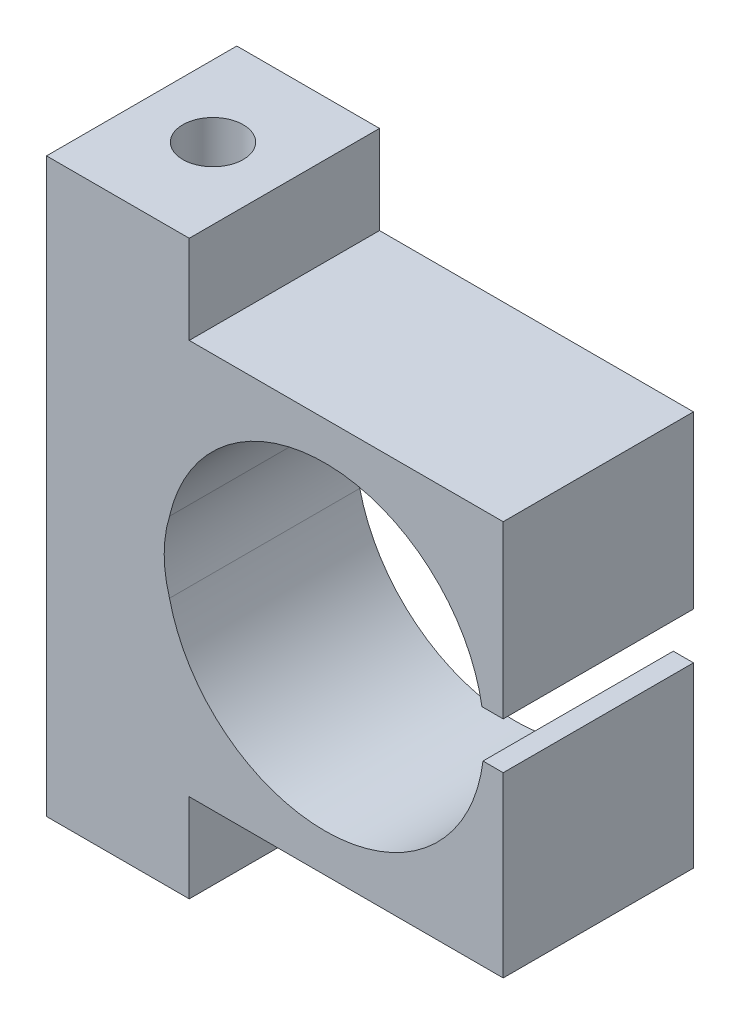
ISO-10303-21;
HEADER;
FILE_DESCRIPTION(('STEP AP214'),'2;1');
FILE_NAME('part.step','',(''),(''),'','','');
FILE_SCHEMA(('AUTOMOTIVE_DESIGN { 1 0 10303 214 1 1 1 1 }'));
ENDSEC;
DATA;
#1=APPLICATION_CONTEXT('core data for automotive mechanical design processes');
#2=APPLICATION_PROTOCOL_DEFINITION('international standard','automotive_design',2000,#1);
#3=PRODUCT_CONTEXT('',#1,'mechanical');
#4=PRODUCT('Part','Part','',(#3));
#5=PRODUCT_RELATED_PRODUCT_CATEGORY('part','',(#4));
#6=PRODUCT_DEFINITION_FORMATION('','',#4);
#7=PRODUCT_DEFINITION_CONTEXT('part definition',#1,'design');
#8=PRODUCT_DEFINITION('design','',#6,#7);
#9=PRODUCT_DEFINITION_SHAPE('','',#8);
#10=(LENGTH_UNIT() NAMED_UNIT(*) SI_UNIT(.MILLI.,.METRE.));
#11=(NAMED_UNIT(*) PLANE_ANGLE_UNIT() SI_UNIT($,.RADIAN.));
#12=(NAMED_UNIT(*) SI_UNIT($,.STERADIAN.) SOLID_ANGLE_UNIT());
#13=UNCERTAINTY_MEASURE_WITH_UNIT(LENGTH_MEASURE(1.E-05),#10,'distance_accuracy_value','');
#14=(GEOMETRIC_REPRESENTATION_CONTEXT(3) GLOBAL_UNCERTAINTY_ASSIGNED_CONTEXT((#13)) GLOBAL_UNIT_ASSIGNED_CONTEXT((#10,
#11,#12)) REPRESENTATION_CONTEXT('',''));
#15=CARTESIAN_POINT('',(0.,0.,0.));
#16=DIRECTION('',(0.,0.,1.));
#17=DIRECTION('',(1.,0.,0.));
#18=AXIS2_PLACEMENT_3D('',#15,#16,#17);
#19=CARTESIAN_POINT('',(-10.0678582465287,25.0678582465287,0.));
#20=DIRECTION('',(-1.,0.,0.));
#21=DIRECTION('',(0.,0.,1.));
#22=AXIS2_PLACEMENT_3D('',#19,#20,#21);
#23=PLANE('',#22);
#24=DIRECTION('',(0.,0.,1.));
#25=VECTOR('',#24,1.);
#26=CARTESIAN_POINT('',(-10.0678582465287,20.7678582465287,0.));
#27=LINE('',#26,#25);
#28=CARTESIAN_POINT('',(-10.0678582465287,20.7678582465287,0.));
#29=VERTEX_POINT('',#28);
#30=CARTESIAN_POINT('',(-10.0678582465287,20.7678582465287,20.));
#31=VERTEX_POINT('',#30);
#32=EDGE_CURVE('E253',#29,#31,#27,.T.);
#33=ORIENTED_EDGE('',*,*,#32,.F.);
#34=DIRECTION('',(0.,-1.,0.));
#35=VECTOR('',#34,1.);
#36=CARTESIAN_POINT('',(-10.0678582465287,25.0678582465287,0.));
#37=LINE('',#36,#35);
#38=CARTESIAN_POINT('',(-10.0678582465287,30.0678582465287,0.));
#39=VERTEX_POINT('',#38);
#40=EDGE_CURVE('E179',#39,#29,#37,.T.);
#41=ORIENTED_EDGE('',*,*,#40,.F.);
#42=DIRECTION('',(0.,0.,-1.));
#43=VECTOR('',#42,1.);
#44=CARTESIAN_POINT('',(-10.0678582465287,30.0678582465287,0.));
#45=LINE('',#44,#43);
#46=CARTESIAN_POINT('',(-10.0678582465287,30.0678582465287,20.));
#47=VERTEX_POINT('',#46);
#48=EDGE_CURVE('E329',#47,#39,#45,.T.);
#49=ORIENTED_EDGE('',*,*,#48,.F.);
#50=DIRECTION('',(0.,-1.,0.));
#51=VECTOR('',#50,1.);
#52=CARTESIAN_POINT('',(-10.0678582465287,25.0678582465287,20.));
#53=LINE('',#52,#51);
#54=EDGE_CURVE('E183',#47,#31,#53,.T.);
#55=ORIENTED_EDGE('',*,*,#54,.T.);
#56=EDGE_LOOP('',(#33,#41,#49,#55));
#57=FACE_BOUND('',#56,.T.);
#58=ADVANCED_FACE('F36',(#57),#23,.F.);
#59=CARTESIAN_POINT('',(-25.0678582465287,-25.0678582465287,20.));
#60=DIRECTION('',(-1.,0.,0.));
#61=DIRECTION('',(0.,0.,1.));
#62=AXIS2_PLACEMENT_3D('',#59,#60,#61);
#63=PLANE('',#62);
#64=DIRECTION('',(0.,1.,0.));
#65=VECTOR('',#64,1.);
#66=CARTESIAN_POINT('',(-25.0678582465287,-25.0678582465287,0.));
#67=LINE('',#66,#65);
#68=CARTESIAN_POINT('',(-25.0678582465287,-30.0678582465287,0.));
#69=VERTEX_POINT('',#68);
#70=CARTESIAN_POINT('',(-25.0678582465287,30.0678582465287,0.));
#71=VERTEX_POINT('',#70);
#72=EDGE_CURVE('E188',#69,#71,#67,.T.);
#73=ORIENTED_EDGE('',*,*,#72,.F.);
#74=DIRECTION('',(0.,0.,-1.));
#75=VECTOR('',#74,1.);
#76=CARTESIAN_POINT('',(-25.0678582465287,-30.0678582465287,20.));
#77=LINE('',#76,#75);
#78=CARTESIAN_POINT('',(-25.0678582465287,-30.0678582465287,20.));
#79=VERTEX_POINT('',#78);
#80=EDGE_CURVE('E252',#79,#69,#77,.T.);
#81=ORIENTED_EDGE('',*,*,#80,.F.);
#82=DIRECTION('',(0.,1.,0.));
#83=VECTOR('',#82,1.);
#84=CARTESIAN_POINT('',(-25.0678582465287,-25.0678582465287,20.));
#85=LINE('',#84,#83);
#86=CARTESIAN_POINT('',(-25.0678582465287,30.0678582465287,20.));
#87=VERTEX_POINT('',#86);
#88=EDGE_CURVE('E190',#79,#87,#85,.T.);
#89=ORIENTED_EDGE('',*,*,#88,.T.);
#90=DIRECTION('',(0.,0.,1.));
#91=VECTOR('',#90,1.);
#92=CARTESIAN_POINT('',(-25.0678582465287,30.0678582465287,0.));
#93=LINE('',#92,#91);
#94=EDGE_CURVE('E322',#71,#87,#93,.T.);
#95=ORIENTED_EDGE('',*,*,#94,.F.);
#96=EDGE_LOOP('',(#73,#81,#89,#95));
#97=FACE_BOUND('',#96,.T.);
#98=ADVANCED_FACE('F38',(#97),#63,.T.);
#99=CARTESIAN_POINT('',(0.,0.,20.));
#100=DIRECTION('',(0.,0.,-1.));
#101=DIRECTION('',(-1.,0.,0.));
#102=AXIS2_PLACEMENT_3D('',#99,#100,#101);
#103=PLANE('',#102);
#104=CARTESIAN_POINT('',(0.,0.,20.));
#105=DIRECTION('',(0.,0.,-1.));
#106=DIRECTION('',(-1.,0.,0.));
#107=AXIS2_PLACEMENT_3D('',#104,#105,#106);
#108=CIRCLE('',#107,12.7);
#109=CARTESIAN_POINT('',(-12.1392678842796,-3.73204705673697,20.));
#110=VERTEX_POINT('',#109);
#111=CARTESIAN_POINT('',(-12.1392678842796,3.73204705673697,20.));
#112=VERTEX_POINT('',#111);
#113=EDGE_CURVE('E162',#110,#112,#108,.T.);
#114=ORIENTED_EDGE('',*,*,#113,.T.);
#115=CARTESIAN_POINT('',(4.1896734398327,0.,20.));
#116=DIRECTION('',(0.,0.,1.));
#117=DIRECTION('',(1.,0.,0.));
#118=AXIS2_PLACEMENT_3D('',#115,#116,#117);
#119=CIRCLE('',#118,16.75);
#120=CARTESIAN_POINT('',(20.7014852370796,2.8147062319713,20.));
#121=VERTEX_POINT('',#120);
#122=EDGE_CURVE('E51',#121,#112,#119,.T.);
#123=ORIENTED_EDGE('',*,*,#122,.F.);
#124=DIRECTION('',(-1.,0.,0.));
#125=VECTOR('',#124,1.);
#126=CARTESIAN_POINT('',(14.9321417534713,2.8147062319713,20.));
#127=LINE('',#126,#125);
#128=CARTESIAN_POINT('',(22.9321417534713,2.8147062319713,20.));
#129=VERTEX_POINT('',#128);
#130=EDGE_CURVE('E158',#129,#121,#127,.T.);
#131=ORIENTED_EDGE('',*,*,#130,.F.);
#132=DIRECTION('',(0.,-1.,0.));
#133=VECTOR('',#132,1.);
#134=CARTESIAN_POINT('',(22.9321417534713,20.7678582465287,20.));
#135=LINE('',#134,#133);
#136=CARTESIAN_POINT('',(22.9321417534713,20.7678582465287,20.));
#137=VERTEX_POINT('',#136);
#138=EDGE_CURVE('E281',#137,#129,#135,.T.);
#139=ORIENTED_EDGE('',*,*,#138,.F.);
#140=DIRECTION('',(1.,0.,0.));
#141=VECTOR('',#140,1.);
#142=CARTESIAN_POINT('',(-10.0678582465287,20.7678582465287,20.));
#143=LINE('',#142,#141);
#144=EDGE_CURVE('E297',#31,#137,#143,.T.);
#145=ORIENTED_EDGE('',*,*,#144,.F.);
#146=ORIENTED_EDGE('',*,*,#54,.F.);
#147=DIRECTION('',(1.,0.,0.));
#148=VECTOR('',#147,1.);
#149=CARTESIAN_POINT('',(-25.0678582465287,30.0678582465287,20.));
#150=LINE('',#149,#148);
#151=EDGE_CURVE('E325',#87,#47,#150,.T.);
#152=ORIENTED_EDGE('',*,*,#151,.F.);
#153=ORIENTED_EDGE('',*,*,#88,.F.);
#154=DIRECTION('',(-1.,0.,0.));
#155=VECTOR('',#154,1.);
#156=CARTESIAN_POINT('',(-25.0678582465287,-30.0678582465287,20.));
#157=LINE('',#156,#155);
#158=CARTESIAN_POINT('',(-10.0678582465287,-30.0678582465287,20.));
#159=VERTEX_POINT('',#158);
#160=EDGE_CURVE('E310',#159,#79,#157,.T.);
#161=ORIENTED_EDGE('',*,*,#160,.F.);
#162=DIRECTION('',(0.,-1.,0.));
#163=VECTOR('',#162,1.);
#164=CARTESIAN_POINT('',(-10.0678582465287,-15.7678582465287,20.));
#165=LINE('',#164,#163);
#166=CARTESIAN_POINT('',(-10.0678582465287,-20.7678582465287,20.));
#167=VERTEX_POINT('',#166);
#168=EDGE_CURVE('E182',#167,#159,#165,.T.);
#169=ORIENTED_EDGE('',*,*,#168,.F.);
#170=DIRECTION('',(-1.,0.,0.));
#171=VECTOR('',#170,1.);
#172=CARTESIAN_POINT('',(-10.0678582465287,-20.7678582465287,20.));
#173=LINE('',#172,#171);
#174=CARTESIAN_POINT('',(22.9321417534713,-20.7678582465287,20.));
#175=VERTEX_POINT('',#174);
#176=EDGE_CURVE('E295',#175,#167,#173,.T.);
#177=ORIENTED_EDGE('',*,*,#176,.F.);
#178=DIRECTION('',(0.,-1.,0.));
#179=VECTOR('',#178,1.);
#180=CARTESIAN_POINT('',(22.9321417534713,-2.07893540389213,20.));
#181=LINE('',#180,#179);
#182=CARTESIAN_POINT('',(22.9321417534713,-2.07893540389213,20.));
#183=VERTEX_POINT('',#182);
#184=EDGE_CURVE('E264',#183,#175,#181,.T.);
#185=ORIENTED_EDGE('',*,*,#184,.F.);
#186=DIRECTION('',(1.,0.,0.));
#187=VECTOR('',#186,1.);
#188=CARTESIAN_POINT('',(12.528688182984,-2.07893540389213,20.));
#189=LINE('',#188,#187);
#190=CARTESIAN_POINT('',(20.8101586188654,-2.07893540389214,20.));
#191=VERTEX_POINT('',#190);
#192=EDGE_CURVE('E169',#191,#183,#189,.T.);
#193=ORIENTED_EDGE('',*,*,#192,.F.);
#194=EDGE_CURVE('E163',#110,#191,#119,.T.);
#195=ORIENTED_EDGE('',*,*,#194,.F.);
#196=EDGE_LOOP('',(#114,#123,#131,#139,#145,#146,#152,#153,#161,#169,#177,#185,#193,#195));
#197=FACE_BOUND('',#196,.T.);
#198=ADVANCED_FACE('F156',(#197),#103,.F.);
#199=CARTESIAN_POINT('',(0.,0.,0.));
#200=DIRECTION('',(0.,0.,-1.));
#201=DIRECTION('',(-1.,0.,0.));
#202=AXIS2_PLACEMENT_3D('',#199,#200,#201);
#203=PLANE('',#202);
#204=CARTESIAN_POINT('',(4.1896734398327,0.,0.));
#205=DIRECTION('',(0.,0.,-1.));
#206=DIRECTION('',(-1.,0.,0.));
#207=AXIS2_PLACEMENT_3D('',#204,#205,#206);
#208=CIRCLE('',#207,16.75);
#209=CARTESIAN_POINT('',(-12.1392678842796,3.73204705673696,0.));
#210=VERTEX_POINT('',#209);
#211=CARTESIAN_POINT('',(20.7014852370796,2.8147062319713,0.));
#212=VERTEX_POINT('',#211);
#213=EDGE_CURVE('E149',#210,#212,#208,.T.);
#214=ORIENTED_EDGE('',*,*,#213,.F.);
#215=CARTESIAN_POINT('',(0.,0.,0.));
#216=DIRECTION('',(0.,0.,-1.));
#217=DIRECTION('',(-1.,0.,0.));
#218=AXIS2_PLACEMENT_3D('',#215,#216,#217);
#219=CIRCLE('',#218,12.7);
#220=CARTESIAN_POINT('',(-12.1392678842796,-3.73204705673696,0.));
#221=VERTEX_POINT('',#220);
#222=EDGE_CURVE('E173',#221,#210,#219,.T.);
#223=ORIENTED_EDGE('',*,*,#222,.F.);
#224=CARTESIAN_POINT('',(20.8101586188654,-2.07893540389214,0.));
#225=VERTEX_POINT('',#224);
#226=EDGE_CURVE('E59',#225,#221,#208,.T.);
#227=ORIENTED_EDGE('',*,*,#226,.F.);
#228=DIRECTION('',(1.,0.,0.));
#229=VECTOR('',#228,1.);
#230=CARTESIAN_POINT('',(12.528688182984,-2.07893540389213,0.));
#231=LINE('',#230,#229);
#232=CARTESIAN_POINT('',(22.9321417534713,-2.07893540389213,0.));
#233=VERTEX_POINT('',#232);
#234=EDGE_CURVE('E176',#225,#233,#231,.T.);
#235=ORIENTED_EDGE('',*,*,#234,.T.);
#236=DIRECTION('',(0.,1.,0.));
#237=VECTOR('',#236,1.);
#238=CARTESIAN_POINT('',(22.9321417534713,-2.07893540389213,0.));
#239=LINE('',#238,#237);
#240=CARTESIAN_POINT('',(22.9321417534713,-20.7678582465287,0.));
#241=VERTEX_POINT('',#240);
#242=EDGE_CURVE('E275',#241,#233,#239,.T.);
#243=ORIENTED_EDGE('',*,*,#242,.F.);
#244=DIRECTION('',(1.,0.,0.));
#245=VECTOR('',#244,1.);
#246=CARTESIAN_POINT('',(-10.0678582465287,-20.7678582465287,0.));
#247=LINE('',#246,#245);
#248=CARTESIAN_POINT('',(-10.0678582465287,-20.7678582465287,0.));
#249=VERTEX_POINT('',#248);
#250=EDGE_CURVE('E293',#249,#241,#247,.T.);
#251=ORIENTED_EDGE('',*,*,#250,.F.);
#252=DIRECTION('',(0.,-1.,0.));
#253=VECTOR('',#252,1.);
#254=CARTESIAN_POINT('',(-10.0678582465287,-15.7678582465287,0.));
#255=LINE('',#254,#253);
#256=CARTESIAN_POINT('',(-10.0678582465287,-30.0678582465287,0.));
#257=VERTEX_POINT('',#256);
#258=EDGE_CURVE('E186',#249,#257,#255,.T.);
#259=ORIENTED_EDGE('',*,*,#258,.T.);
#260=DIRECTION('',(1.,0.,0.));
#261=VECTOR('',#260,1.);
#262=CARTESIAN_POINT('',(-25.0678582465287,-30.0678582465287,0.));
#263=LINE('',#262,#261);
#264=EDGE_CURVE('E304',#69,#257,#263,.T.);
#265=ORIENTED_EDGE('',*,*,#264,.F.);
#266=ORIENTED_EDGE('',*,*,#72,.T.);
#267=DIRECTION('',(-1.,0.,0.));
#268=VECTOR('',#267,1.);
#269=CARTESIAN_POINT('',(-25.0678582465287,30.0678582465287,0.));
#270=LINE('',#269,#268);
#271=EDGE_CURVE('E332',#39,#71,#270,.T.);
#272=ORIENTED_EDGE('',*,*,#271,.F.);
#273=ORIENTED_EDGE('',*,*,#40,.T.);
#274=DIRECTION('',(1.,0.,0.));
#275=VECTOR('',#274,1.);
#276=CARTESIAN_POINT('',(-10.0678582465287,20.7678582465287,0.));
#277=LINE('',#276,#275);
#278=CARTESIAN_POINT('',(22.9321417534713,20.7678582465287,0.));
#279=VERTEX_POINT('',#278);
#280=EDGE_CURVE('E299',#29,#279,#277,.T.);
#281=ORIENTED_EDGE('',*,*,#280,.T.);
#282=DIRECTION('',(0.,1.,0.));
#283=VECTOR('',#282,1.);
#284=CARTESIAN_POINT('',(22.9321417534713,20.7678582465287,0.));
#285=LINE('',#284,#283);
#286=CARTESIAN_POINT('',(22.9321417534713,2.8147062319713,0.));
#287=VERTEX_POINT('',#286);
#288=EDGE_CURVE('E284',#287,#279,#285,.T.);
#289=ORIENTED_EDGE('',*,*,#288,.F.);
#290=DIRECTION('',(-1.,0.,0.));
#291=VECTOR('',#290,1.);
#292=CARTESIAN_POINT('',(14.9321417534713,2.8147062319713,0.));
#293=LINE('',#292,#291);
#294=EDGE_CURVE('E171',#287,#212,#293,.T.);
#295=ORIENTED_EDGE('',*,*,#294,.T.);
#296=EDGE_LOOP('',(#214,#223,#227,#235,#243,#251,#259,#265,#266,#272,#273,#281,#289,#295));
#297=FACE_BOUND('',#296,.T.);
#298=ADVANCED_FACE('F259',(#297),#203,.T.);
#299=CARTESIAN_POINT('',(-10.0678582465287,-15.7678582465287,0.));
#300=DIRECTION('',(-1.,0.,0.));
#301=DIRECTION('',(0.,0.,1.));
#302=AXIS2_PLACEMENT_3D('',#299,#300,#301);
#303=PLANE('',#302);
#304=ORIENTED_EDGE('',*,*,#258,.F.);
#305=DIRECTION('',(0.,0.,-1.));
#306=VECTOR('',#305,1.);
#307=CARTESIAN_POINT('',(-10.0678582465287,-20.7678582465287,20.));
#308=LINE('',#307,#306);
#309=EDGE_CURVE('E290',#167,#249,#308,.T.);
#310=ORIENTED_EDGE('',*,*,#309,.F.);
#311=ORIENTED_EDGE('',*,*,#168,.T.);
#312=DIRECTION('',(0.,0.,1.));
#313=VECTOR('',#312,1.);
#314=CARTESIAN_POINT('',(-10.0678582465287,-30.0678582465287,20.));
#315=LINE('',#314,#313);
#316=EDGE_CURVE('E307',#257,#159,#315,.T.);
#317=ORIENTED_EDGE('',*,*,#316,.F.);
#318=EDGE_LOOP('',(#304,#310,#311,#317));
#319=FACE_BOUND('',#318,.T.);
#320=ADVANCED_FACE('F353',(#319),#303,.F.);
#321=CARTESIAN_POINT('',(12.528688182984,-2.07893540389213,0.));
#322=DIRECTION('',(0.,-1.,0.));
#323=DIRECTION('',(1.,0.,0.));
#324=AXIS2_PLACEMENT_3D('',#321,#322,#323);
#325=PLANE('',#324);
#326=ORIENTED_EDGE('',*,*,#234,.F.);
#327=DIRECTION('',(0.,0.,1.));
#328=VECTOR('',#327,1.);
#329=CARTESIAN_POINT('',(20.8101586188654,-2.07893540389214,-23.));
#330=LINE('',#329,#328);
#331=EDGE_CURVE('E262',#225,#191,#330,.T.);
#332=ORIENTED_EDGE('',*,*,#331,.T.);
#333=ORIENTED_EDGE('',*,*,#192,.T.);
#334=DIRECTION('',(0.,0.,1.));
#335=VECTOR('',#334,1.);
#336=CARTESIAN_POINT('',(22.9321417534713,-2.07893540389213,20.));
#337=LINE('',#336,#335);
#338=EDGE_CURVE('E278',#233,#183,#337,.T.);
#339=ORIENTED_EDGE('',*,*,#338,.F.);
#340=EDGE_LOOP('',(#326,#332,#333,#339));
#341=FACE_BOUND('',#340,.T.);
#342=ADVANCED_FACE('F341',(#341),#325,.F.);
#343=CARTESIAN_POINT('',(14.9321417534713,2.8147062319713,0.));
#344=DIRECTION('',(0.,1.,0.));
#345=DIRECTION('',(0.,0.,1.));
#346=AXIS2_PLACEMENT_3D('',#343,#344,#345);
#347=PLANE('',#346);
#348=ORIENTED_EDGE('',*,*,#130,.T.);
#349=DIRECTION('',(0.,0.,1.));
#350=VECTOR('',#349,1.);
#351=CARTESIAN_POINT('',(20.7014852370796,2.8147062319713,-23.));
#352=LINE('',#351,#350);
#353=EDGE_CURVE('E146',#121,#212,#352,.F.);
#354=ORIENTED_EDGE('',*,*,#353,.T.);
#355=ORIENTED_EDGE('',*,*,#294,.F.);
#356=DIRECTION('',(0.,0.,-1.));
#357=VECTOR('',#356,1.);
#358=CARTESIAN_POINT('',(22.9321417534713,2.8147062319713,20.));
#359=LINE('',#358,#357);
#360=EDGE_CURVE('E167',#129,#287,#359,.T.);
#361=ORIENTED_EDGE('',*,*,#360,.F.);
#362=EDGE_LOOP('',(#348,#354,#355,#361));
#363=FACE_BOUND('',#362,.T.);
#364=ADVANCED_FACE('F165',(#363),#347,.F.);
#365=CARTESIAN_POINT('',(0.,0.,20.));
#366=DIRECTION('',(0.,0.,-1.));
#367=DIRECTION('',(-1.,0.,0.));
#368=AXIS2_PLACEMENT_3D('',#365,#366,#367);
#369=CYLINDRICAL_SURFACE('',#368,12.7);
#370=ORIENTED_EDGE('',*,*,#113,.F.);
#371=DIRECTION('',(0.,0.,1.));
#372=VECTOR('',#371,1.);
#373=CARTESIAN_POINT('',(-12.1392678842796,-3.73204705673696,-1.50000000000001));
#374=LINE('',#373,#372);
#375=EDGE_CURVE('E11',#110,#221,#374,.F.);
#376=ORIENTED_EDGE('',*,*,#375,.T.);
#377=ORIENTED_EDGE('',*,*,#222,.T.);
#378=DIRECTION('',(0.,0.,1.));
#379=VECTOR('',#378,1.);
#380=CARTESIAN_POINT('',(-12.1392678842796,3.73204705673696,-1.50000000000001));
#381=LINE('',#380,#379);
#382=EDGE_CURVE('E44',#210,#112,#381,.T.);
#383=ORIENTED_EDGE('',*,*,#382,.T.);
#384=EDGE_LOOP('',(#370,#376,#377,#383));
#385=FACE_BOUND('',#384,.T.);
#386=ADVANCED_FACE('F256',(#385),#369,.F.);
#387=CARTESIAN_POINT('',(-17.5678582465287,-25.0678582465287,9.99929091446437));
#388=DIRECTION('',(0.,-1.,0.));
#389=DIRECTION('',(0.,0.,-1.));
#390=AXIS2_PLACEMENT_3D('',#387,#388,#389);
#391=CYLINDRICAL_SURFACE('',#390,3.17500000000001);
#392=DIRECTION('',(0.,-1.,0.));
#393=VECTOR('',#392,1.);
#394=CARTESIAN_POINT('',(-14.3928582663241,12.9321417534713,9.99964545721471));
#395=LINE('',#394,#393);
#396=CARTESIAN_POINT('',(-14.3928582663241,25.0678582465287,9.99964545721471));
#397=VERTEX_POINT('',#396);
#398=CARTESIAN_POINT('',(-14.3928582663241,10.0678582465287,9.99964545721471));
#399=VERTEX_POINT('',#398);
#400=EDGE_CURVE('E313',#397,#399,#395,.T.);
#401=ORIENTED_EDGE('',*,*,#400,.F.);
#402=CARTESIAN_POINT('',(-17.5678582465287,25.0678582465287,10.));
#403=DIRECTION('',(0.,1.,0.));
#404=DIRECTION('',(-0.99999999376524,0.,-0.000111667009204576));
#405=AXIS2_PLACEMENT_3D('',#402,#403,#404);
#406=CIRCLE('',#405,3.17500000000001);
#407=CARTESIAN_POINT('',(-20.7428582267334,25.0678582465287,9.99964545724578));
#408=VERTEX_POINT('',#407);
#409=EDGE_CURVE('E192',#408,#397,#406,.T.);
#410=ORIENTED_EDGE('',*,*,#409,.F.);
#411=DIRECTION('',(0.,-1.,0.));
#412=VECTOR('',#411,1.);
#413=CARTESIAN_POINT('',(-20.7428582267334,12.9321417534713,9.99964545724578));
#414=LINE('',#413,#412);
#415=CARTESIAN_POINT('',(-20.7428582267334,10.0678582465287,9.99964545724578));
#416=VERTEX_POINT('',#415);
#417=EDGE_CURVE('E321',#416,#408,#414,.F.);
#418=ORIENTED_EDGE('',*,*,#417,.F.);
#419=CARTESIAN_POINT('',(-17.5678582465287,10.0678582465287,10.));
#420=DIRECTION('',(0.,-1.,0.));
#421=DIRECTION('',(0.999999993765238,0.,-0.000111667018989509));
#422=AXIS2_PLACEMENT_3D('',#419,#420,#421);
#423=CIRCLE('',#422,3.17500000000001);
#424=EDGE_CURVE('E241',#399,#416,#423,.T.);
#425=ORIENTED_EDGE('',*,*,#424,.F.);
#426=EDGE_LOOP('',(#401,#410,#418,#425));
#427=FACE_BOUND('',#426,.T.);
#428=CARTESIAN_POINT('',(-17.5678582465287,30.0678582465287,9.99929091446437));
#429=DIRECTION('',(0.,1.,0.));
#430=DIRECTION('',(0.,0.,1.));
#431=AXIS2_PLACEMENT_3D('',#428,#429,#430);
#432=CIRCLE('',#431,3.17500000000001);
#433=CARTESIAN_POINT('',(-17.5678582465287,30.0678582465287,13.1742909144644));
#434=VERTEX_POINT('',#433);
#435=EDGE_CURVE('E326',#434,#434,#432,.T.);
#436=ORIENTED_EDGE('',*,*,#435,.T.);
#437=EDGE_LOOP('',(#436));
#438=FACE_BOUND('',#437,.T.);
#439=CARTESIAN_POINT('',(-17.5678582465287,-30.0678582465287,9.99929091446437));
#440=DIRECTION('',(0.,-1.,0.));
#441=DIRECTION('',(1.,0.,0.));
#442=AXIS2_PLACEMENT_3D('',#439,#440,#441);
#443=CIRCLE('',#442,3.17500000000001);
#444=CARTESIAN_POINT('',(-14.3928582465287,-30.0678582465287,9.99929091446437));
#445=VERTEX_POINT('',#444);
#446=EDGE_CURVE('E245',#445,#445,#443,.T.);
#447=ORIENTED_EDGE('',*,*,#446,.T.);
#448=EDGE_LOOP('',(#447));
#449=FACE_BOUND('',#448,.T.);
#450=ADVANCED_FACE('F218',(#427,#438,#449),#391,.F.);
#451=CARTESIAN_POINT('',(0.,30.0678582465287,0.));
#452=DIRECTION('',(0.,1.,0.));
#453=DIRECTION('',(0.,0.,1.));
#454=AXIS2_PLACEMENT_3D('',#451,#452,#453);
#455=PLANE('',#454);
#456=ORIENTED_EDGE('',*,*,#435,.F.);
#457=EDGE_LOOP('',(#456));
#458=FACE_BOUND('',#457,.T.);
#459=ORIENTED_EDGE('',*,*,#94,.T.);
#460=ORIENTED_EDGE('',*,*,#151,.T.);
#461=ORIENTED_EDGE('',*,*,#48,.T.);
#462=ORIENTED_EDGE('',*,*,#271,.T.);
#463=EDGE_LOOP('',(#459,#460,#461,#462));
#464=FACE_BOUND('',#463,.T.);
#465=ADVANCED_FACE('F216',(#458,#464),#455,.T.);
#466=CARTESIAN_POINT('',(-17.5678582465287,25.0678582465287,10.));
#467=DIRECTION('',(0.,1.,0.));
#468=DIRECTION('',(0.,0.,1.));
#469=AXIS2_PLACEMENT_3D('',#466,#467,#468);
#470=CYLINDRICAL_SURFACE('',#469,3.17500000000001);
#471=ORIENTED_EDGE('',*,*,#424,.T.);
#472=ORIENTED_EDGE('',*,*,#417,.T.);
#473=ORIENTED_EDGE('',*,*,#409,.T.);
#474=ORIENTED_EDGE('',*,*,#400,.T.);
#475=EDGE_LOOP('',(#471,#472,#473,#474));
#476=FACE_BOUND('',#475,.T.);
#477=ADVANCED_FACE('F205',(#476),#470,.F.);
#478=CARTESIAN_POINT('',(0.,-30.0678582465287,0.));
#479=DIRECTION('',(0.,-1.,0.));
#480=DIRECTION('',(1.,0.,0.));
#481=AXIS2_PLACEMENT_3D('',#478,#479,#480);
#482=PLANE('',#481);
#483=ORIENTED_EDGE('',*,*,#446,.F.);
#484=EDGE_LOOP('',(#483));
#485=FACE_BOUND('',#484,.T.);
#486=ORIENTED_EDGE('',*,*,#80,.T.);
#487=ORIENTED_EDGE('',*,*,#264,.T.);
#488=ORIENTED_EDGE('',*,*,#316,.T.);
#489=ORIENTED_EDGE('',*,*,#160,.T.);
#490=EDGE_LOOP('',(#486,#487,#488,#489));
#491=FACE_BOUND('',#490,.T.);
#492=ADVANCED_FACE('F215',(#485,#491),#482,.T.);
#493=CARTESIAN_POINT('',(0.,20.7678582465287,0.));
#494=DIRECTION('',(0.,-1.,0.));
#495=DIRECTION('',(1.,0.,0.));
#496=AXIS2_PLACEMENT_3D('',#493,#494,#495);
#497=PLANE('',#496);
#498=ORIENTED_EDGE('',*,*,#144,.T.);
#499=DIRECTION('',(0.,0.,1.));
#500=VECTOR('',#499,1.);
#501=CARTESIAN_POINT('',(22.9321417534713,20.7678582465287,20.));
#502=LINE('',#501,#500);
#503=EDGE_CURVE('E287',#279,#137,#502,.T.);
#504=ORIENTED_EDGE('',*,*,#503,.F.);
#505=ORIENTED_EDGE('',*,*,#280,.F.);
#506=ORIENTED_EDGE('',*,*,#32,.T.);
#507=EDGE_LOOP('',(#498,#504,#505,#506));
#508=FACE_BOUND('',#507,.T.);
#509=ADVANCED_FACE('F387',(#508),#497,.F.);
#510=CARTESIAN_POINT('',(0.,-20.7678582465287,0.));
#511=DIRECTION('',(0.,-1.,0.));
#512=DIRECTION('',(0.,0.,-1.));
#513=AXIS2_PLACEMENT_3D('',#510,#511,#512);
#514=PLANE('',#513);
#515=ORIENTED_EDGE('',*,*,#309,.T.);
#516=ORIENTED_EDGE('',*,*,#250,.T.);
#517=DIRECTION('',(0.,0.,-1.));
#518=VECTOR('',#517,1.);
#519=CARTESIAN_POINT('',(22.9321417534713,-20.7678582465287,20.));
#520=LINE('',#519,#518);
#521=EDGE_CURVE('E270',#175,#241,#520,.T.);
#522=ORIENTED_EDGE('',*,*,#521,.F.);
#523=ORIENTED_EDGE('',*,*,#176,.T.);
#524=EDGE_LOOP('',(#515,#516,#522,#523));
#525=FACE_BOUND('',#524,.T.);
#526=ADVANCED_FACE('F346',(#525),#514,.T.);
#527=CARTESIAN_POINT('',(22.9321417534713,0.,0.));
#528=DIRECTION('',(1.,0.,0.));
#529=DIRECTION('',(0.,0.,-1.));
#530=AXIS2_PLACEMENT_3D('',#527,#528,#529);
#531=PLANE('',#530);
#532=ORIENTED_EDGE('',*,*,#138,.T.);
#533=ORIENTED_EDGE('',*,*,#360,.T.);
#534=ORIENTED_EDGE('',*,*,#288,.T.);
#535=ORIENTED_EDGE('',*,*,#503,.T.);
#536=EDGE_LOOP('',(#532,#533,#534,#535));
#537=FACE_BOUND('',#536,.T.);
#538=ADVANCED_FACE('F396',(#537),#531,.T.);
#539=CARTESIAN_POINT('',(22.9321417534713,0.,0.));
#540=DIRECTION('',(1.,0.,0.));
#541=DIRECTION('',(0.,0.,-1.));
#542=AXIS2_PLACEMENT_3D('',#539,#540,#541);
#543=PLANE('',#542);
#544=ORIENTED_EDGE('',*,*,#184,.T.);
#545=ORIENTED_EDGE('',*,*,#521,.T.);
#546=ORIENTED_EDGE('',*,*,#242,.T.);
#547=ORIENTED_EDGE('',*,*,#338,.T.);
#548=EDGE_LOOP('',(#544,#545,#546,#547));
#549=FACE_BOUND('',#548,.T.);
#550=ADVANCED_FACE('F338',(#549),#543,.T.);
#551=CARTESIAN_POINT('',(4.1896734398327,0.,-23.));
#552=DIRECTION('',(0.,0.,1.));
#553=DIRECTION('',(1.,0.,0.));
#554=AXIS2_PLACEMENT_3D('',#551,#552,#553);
#555=CYLINDRICAL_SURFACE('',#554,16.75);
#556=ORIENTED_EDGE('',*,*,#122,.T.);
#557=ORIENTED_EDGE('',*,*,#382,.F.);
#558=ORIENTED_EDGE('',*,*,#213,.T.);
#559=ORIENTED_EDGE('',*,*,#353,.F.);
#560=EDGE_LOOP('',(#556,#557,#558,#559));
#561=FACE_BOUND('',#560,.T.);
#562=ADVANCED_FACE('F147',(#561),#555,.F.);
#563=ORIENTED_EDGE('',*,*,#226,.T.);
#564=ORIENTED_EDGE('',*,*,#375,.F.);
#565=ORIENTED_EDGE('',*,*,#194,.T.);
#566=ORIENTED_EDGE('',*,*,#331,.F.);
#567=EDGE_LOOP('',(#563,#564,#565,#566));
#568=FACE_BOUND('',#567,.T.);
#569=ADVANCED_FACE('F402',(#568),#555,.F.);
#570=CLOSED_SHELL('',(#58,#98,#198,#298,#320,#342,#364,#386,#450,#465,#477,#492,#509,#526,#538,
#550,#562,#569));
#571=MANIFOLD_SOLID_BREP('B2',#570);
#572=ADVANCED_BREP_SHAPE_REPRESENTATION('',(#18,#571),#14);
#573=SHAPE_DEFINITION_REPRESENTATION(#9,#572);
ENDSEC;
END-ISO-10303-21;
